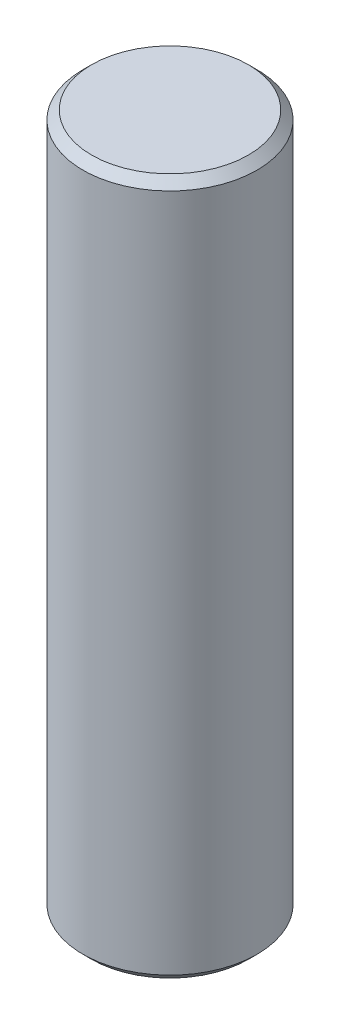
ISO-10303-21;
HEADER;
FILE_DESCRIPTION(('STEP AP214'),'2;1');
FILE_NAME('part.step','',(''),(''),'','','');
FILE_SCHEMA(('AUTOMOTIVE_DESIGN { 1 0 10303 214 1 1 1 1 }'));
ENDSEC;
DATA;
#1=APPLICATION_CONTEXT('core data for automotive mechanical design processes');
#2=APPLICATION_PROTOCOL_DEFINITION('international standard','automotive_design',2000,#1);
#3=PRODUCT_CONTEXT('',#1,'mechanical');
#4=PRODUCT('Part','Part','',(#3));
#5=PRODUCT_RELATED_PRODUCT_CATEGORY('part','',(#4));
#6=PRODUCT_DEFINITION_FORMATION('','',#4);
#7=PRODUCT_DEFINITION_CONTEXT('part definition',#1,'design');
#8=PRODUCT_DEFINITION('design','',#6,#7);
#9=PRODUCT_DEFINITION_SHAPE('','',#8);
#10=(LENGTH_UNIT() NAMED_UNIT(*) SI_UNIT(.MILLI.,.METRE.));
#11=(NAMED_UNIT(*) PLANE_ANGLE_UNIT() SI_UNIT($,.RADIAN.));
#12=(NAMED_UNIT(*) SI_UNIT($,.STERADIAN.) SOLID_ANGLE_UNIT());
#13=UNCERTAINTY_MEASURE_WITH_UNIT(LENGTH_MEASURE(1.E-05),#10,'distance_accuracy_value','');
#14=(GEOMETRIC_REPRESENTATION_CONTEXT(3) GLOBAL_UNCERTAINTY_ASSIGNED_CONTEXT((#13)) GLOBAL_UNIT_ASSIGNED_CONTEXT((#10,
#11,#12)) REPRESENTATION_CONTEXT('',''));
#15=CARTESIAN_POINT('',(0.,0.,0.));
#16=DIRECTION('',(0.,0.,1.));
#17=DIRECTION('',(1.,0.,0.));
#18=AXIS2_PLACEMENT_3D('',#15,#16,#17);
#19=CARTESIAN_POINT('',(4.99999999999999,0.,0.));
#20=DIRECTION('',(0.,-1.,0.));
#21=DIRECTION('',(1.,0.,0.));
#22=AXIS2_PLACEMENT_3D('',#19,#20,#21);
#23=PLANE('',#22);
#24=CARTESIAN_POINT('',(0.,0.,0.));
#25=DIRECTION('',(0.,-1.,0.));
#26=DIRECTION('',(1.,0.,0.));
#27=AXIS2_PLACEMENT_3D('',#24,#25,#26);
#28=CIRCLE('',#27,4.5);
#29=CARTESIAN_POINT('',(4.5,0.,0.));
#30=VERTEX_POINT('',#29);
#31=EDGE_CURVE('E46',#30,#30,#28,.T.);
#32=ORIENTED_EDGE('',*,*,#31,.T.);
#33=EDGE_LOOP('',(#32));
#34=FACE_BOUND('',#33,.T.);
#35=ADVANCED_FACE('F31',(#34),#23,.T.);
#36=CARTESIAN_POINT('',(0.,0.,0.));
#37=DIRECTION('',(0.,-1.,0.));
#38=DIRECTION('',(1.,0.,0.));
#39=AXIS2_PLACEMENT_3D('',#36,#37,#38);
#40=CYLINDRICAL_SURFACE('',#39,4.99999999999999);
#41=CARTESIAN_POINT('',(0.,0.500000000000003,0.));
#42=DIRECTION('',(0.,-1.,0.));
#43=DIRECTION('',(1.,0.,0.));
#44=AXIS2_PLACEMENT_3D('',#41,#42,#43);
#45=CIRCLE('',#44,4.99999999999999);
#46=CARTESIAN_POINT('',(4.99999999999999,0.500000000000002,0.));
#47=VERTEX_POINT('',#46);
#48=EDGE_CURVE('E38',#47,#47,#45,.F.);
#49=ORIENTED_EDGE('',*,*,#48,.T.);
#50=EDGE_LOOP('',(#49));
#51=FACE_BOUND('',#50,.T.);
#52=CARTESIAN_POINT('',(0.,39.5,0.));
#53=DIRECTION('',(0.,1.,0.));
#54=DIRECTION('',(-1.,0.,0.));
#55=AXIS2_PLACEMENT_3D('',#52,#53,#54);
#56=CIRCLE('',#55,4.99999999999999);
#57=CARTESIAN_POINT('',(-4.99999999999999,39.5,0.));
#58=VERTEX_POINT('',#57);
#59=EDGE_CURVE('E42',#58,#58,#56,.F.);
#60=ORIENTED_EDGE('',*,*,#59,.T.);
#61=EDGE_LOOP('',(#60));
#62=FACE_BOUND('',#61,.T.);
#63=ADVANCED_FACE('F62',(#51,#62),#40,.T.);
#64=CARTESIAN_POINT('',(0.,40.,0.));
#65=DIRECTION('',(0.,1.,0.));
#66=DIRECTION('',(-1.,0.,0.));
#67=AXIS2_PLACEMENT_3D('',#64,#65,#66);
#68=PLANE('',#67);
#69=CARTESIAN_POINT('',(0.,40.,0.));
#70=DIRECTION('',(0.,1.,0.));
#71=DIRECTION('',(-1.,0.,0.));
#72=AXIS2_PLACEMENT_3D('',#69,#70,#71);
#73=CIRCLE('',#72,4.49999999999998);
#74=CARTESIAN_POINT('',(-4.49999999999998,40.,0.));
#75=VERTEX_POINT('',#74);
#76=EDGE_CURVE('E10',#75,#75,#73,.T.);
#77=ORIENTED_EDGE('',*,*,#76,.T.);
#78=EDGE_LOOP('',(#77));
#79=FACE_BOUND('',#78,.T.);
#80=ADVANCED_FACE('F55',(#79),#68,.T.);
#81=CARTESIAN_POINT('',(0.,0.,0.));
#82=DIRECTION('',(0.,1.,0.));
#83=DIRECTION('',(-1.,0.,0.));
#84=AXIS2_PLACEMENT_3D('',#81,#82,#83);
#85=CONICAL_SURFACE('',#84,4.5,0.785398163397441);
#86=ORIENTED_EDGE('',*,*,#48,.F.);
#87=EDGE_LOOP('',(#86));
#88=FACE_BOUND('',#87,.T.);
#89=ORIENTED_EDGE('',*,*,#31,.F.);
#90=EDGE_LOOP('',(#89));
#91=FACE_BOUND('',#90,.T.);
#92=ADVANCED_FACE('F53',(#88,#91),#85,.T.);
#93=CARTESIAN_POINT('',(0.,39.5,0.));
#94=DIRECTION('',(0.,-1.,0.));
#95=DIRECTION('',(1.,0.,0.));
#96=AXIS2_PLACEMENT_3D('',#93,#94,#95);
#97=CONICAL_SURFACE('',#96,4.99999999999999,0.785398163397436);
#98=ORIENTED_EDGE('',*,*,#76,.F.);
#99=EDGE_LOOP('',(#98));
#100=FACE_BOUND('',#99,.T.);
#101=ORIENTED_EDGE('',*,*,#59,.F.);
#102=EDGE_LOOP('',(#101));
#103=FACE_BOUND('',#102,.T.);
#104=ADVANCED_FACE('F33',(#100,#103),#97,.T.);
#105=CLOSED_SHELL('',(#35,#63,#80,#92,#104));
#106=MANIFOLD_SOLID_BREP('B2',#105);
#107=ADVANCED_BREP_SHAPE_REPRESENTATION('',(#18,#106),#14);
#108=SHAPE_DEFINITION_REPRESENTATION(#9,#107);
ENDSEC;
END-ISO-10303-21;
